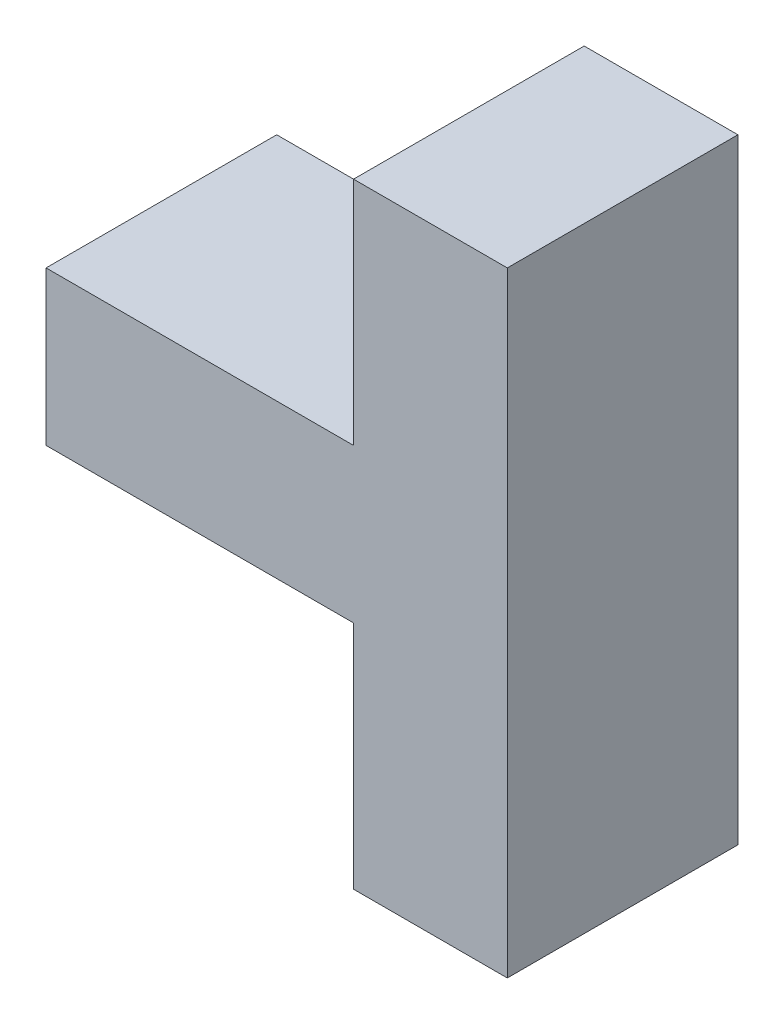
ISO-10303-21;
HEADER;
FILE_DESCRIPTION(('STEP AP214'),'2;1');
FILE_NAME('part.step','',(''),(''),'','','');
FILE_SCHEMA(('AUTOMOTIVE_DESIGN { 1 0 10303 214 1 1 1 1 }'));
ENDSEC;
DATA;
#1=APPLICATION_CONTEXT('core data for automotive mechanical design processes');
#2=APPLICATION_PROTOCOL_DEFINITION('international standard','automotive_design',2000,#1);
#3=PRODUCT_CONTEXT('',#1,'mechanical');
#4=PRODUCT('Part','Part','',(#3));
#5=PRODUCT_RELATED_PRODUCT_CATEGORY('part','',(#4));
#6=PRODUCT_DEFINITION_FORMATION('','',#4);
#7=PRODUCT_DEFINITION_CONTEXT('part definition',#1,'design');
#8=PRODUCT_DEFINITION('design','',#6,#7);
#9=PRODUCT_DEFINITION_SHAPE('','',#8);
#10=(LENGTH_UNIT() NAMED_UNIT(*) SI_UNIT(.MILLI.,.METRE.));
#11=(NAMED_UNIT(*) PLANE_ANGLE_UNIT() SI_UNIT($,.RADIAN.));
#12=(NAMED_UNIT(*) SI_UNIT($,.STERADIAN.) SOLID_ANGLE_UNIT());
#13=UNCERTAINTY_MEASURE_WITH_UNIT(LENGTH_MEASURE(1.E-05),#10,'distance_accuracy_value','');
#14=(GEOMETRIC_REPRESENTATION_CONTEXT(3) GLOBAL_UNCERTAINTY_ASSIGNED_CONTEXT((#13)) GLOBAL_UNIT_ASSIGNED_CONTEXT((#10,
#11,#12)) REPRESENTATION_CONTEXT('',''));
#15=CARTESIAN_POINT('',(0.,0.,0.));
#16=DIRECTION('',(0.,0.,1.));
#17=DIRECTION('',(1.,0.,0.));
#18=AXIS2_PLACEMENT_3D('',#15,#16,#17);
#19=CARTESIAN_POINT('',(0.09999980000001,-0.09999980000001,0.));
#20=DIRECTION('',(1.,0.,0.));
#21=DIRECTION('',(0.,0.,-1.));
#22=AXIS2_PLACEMENT_3D('',#19,#20,#21);
#23=PLANE('',#22);
#24=DIRECTION('',(0.,0.,1.));
#25=VECTOR('',#24,1.);
#26=CARTESIAN_POINT('',(0.09999980000001,-0.3999992,0.));
#27=LINE('',#26,#25);
#28=CARTESIAN_POINT('',(0.09999980000001,-0.3999992,0.));
#29=VERTEX_POINT('',#28);
#30=CARTESIAN_POINT('',(0.09999980000001,-0.3999992,0.2999994));
#31=VERTEX_POINT('',#30);
#32=EDGE_CURVE('E84',#29,#31,#27,.T.);
#33=ORIENTED_EDGE('',*,*,#32,.T.);
#34=DIRECTION('',(0.,1.,0.));
#35=VECTOR('',#34,1.);
#36=CARTESIAN_POINT('',(0.09999980000001,-0.3999992,0.2999994));
#37=LINE('',#36,#35);
#38=CARTESIAN_POINT('',(0.09999980000001,-0.09999980000001,0.2999994));
#39=VERTEX_POINT('',#38);
#40=EDGE_CURVE('E86',#31,#39,#37,.T.);
#41=ORIENTED_EDGE('',*,*,#40,.T.);
#42=DIRECTION('',(0.,0.,1.));
#43=VECTOR('',#42,1.);
#44=CARTESIAN_POINT('',(0.09999980000001,-0.09999980000001,0.));
#45=LINE('',#44,#43);
#46=CARTESIAN_POINT('',(0.09999980000001,-0.09999980000001,0.));
#47=VERTEX_POINT('',#46);
#48=EDGE_CURVE('E20',#39,#47,#45,.F.);
#49=ORIENTED_EDGE('',*,*,#48,.T.);
#50=DIRECTION('',(0.,1.,0.));
#51=VECTOR('',#50,1.);
#52=CARTESIAN_POINT('',(0.09999980000001,-0.3999992,0.));
#53=LINE('',#52,#51);
#54=EDGE_CURVE('E87',#29,#47,#53,.T.);
#55=ORIENTED_EDGE('',*,*,#54,.F.);
#56=EDGE_LOOP('',(#33,#41,#49,#55));
#57=FACE_BOUND('',#56,.T.);
#58=ADVANCED_FACE('F17',(#57),#23,.F.);
#59=CARTESIAN_POINT('',(-0.2999994,-0.09999980000001,0.));
#60=DIRECTION('',(0.,1.,0.));
#61=DIRECTION('',(0.,0.,1.));
#62=AXIS2_PLACEMENT_3D('',#59,#60,#61);
#63=PLANE('',#62);
#64=ORIENTED_EDGE('',*,*,#48,.F.);
#65=DIRECTION('',(-1.,0.,0.));
#66=VECTOR('',#65,1.);
#67=CARTESIAN_POINT('',(0.2999994,-0.09999980000001,0.2999994));
#68=LINE('',#67,#66);
#69=CARTESIAN_POINT('',(-0.2999994,-0.09999980000001,0.2999994));
#70=VERTEX_POINT('',#69);
#71=EDGE_CURVE('E101',#39,#70,#68,.T.);
#72=ORIENTED_EDGE('',*,*,#71,.T.);
#73=DIRECTION('',(0.,0.,-1.));
#74=VECTOR('',#73,1.);
#75=CARTESIAN_POINT('',(-0.2999994,-0.09999980000001,0.));
#76=LINE('',#75,#74);
#77=CARTESIAN_POINT('',(-0.2999994,-0.09999980000001,0.));
#78=VERTEX_POINT('',#77);
#79=EDGE_CURVE('E113',#70,#78,#76,.T.);
#80=ORIENTED_EDGE('',*,*,#79,.T.);
#81=DIRECTION('',(-1.,0.,0.));
#82=VECTOR('',#81,1.);
#83=CARTESIAN_POINT('',(0.2999994,-0.09999980000001,0.));
#84=LINE('',#83,#82);
#85=EDGE_CURVE('E116',#47,#78,#84,.T.);
#86=ORIENTED_EDGE('',*,*,#85,.F.);
#87=EDGE_LOOP('',(#64,#72,#80,#86));
#88=FACE_BOUND('',#87,.T.);
#89=ADVANCED_FACE('F117',(#88),#63,.F.);
#90=CARTESIAN_POINT('',(-0.2999994,0.09999979999999,0.));
#91=DIRECTION('',(1.,0.,0.));
#92=DIRECTION('',(0.,0.,-1.));
#93=AXIS2_PLACEMENT_3D('',#90,#91,#92);
#94=PLANE('',#93);
#95=ORIENTED_EDGE('',*,*,#79,.F.);
#96=DIRECTION('',(0.,1.,0.));
#97=VECTOR('',#96,1.);
#98=CARTESIAN_POINT('',(-0.2999994,-0.3999992,0.2999994));
#99=LINE('',#98,#97);
#100=CARTESIAN_POINT('',(-0.2999994,0.09999979999999,0.2999994));
#101=VERTEX_POINT('',#100);
#102=EDGE_CURVE('E137',#70,#101,#99,.T.);
#103=ORIENTED_EDGE('',*,*,#102,.T.);
#104=DIRECTION('',(0.,0.,-1.));
#105=VECTOR('',#104,1.);
#106=CARTESIAN_POINT('',(-0.2999994,0.09999979999999,0.));
#107=LINE('',#106,#105);
#108=CARTESIAN_POINT('',(-0.2999994,0.09999979999999,0.));
#109=VERTEX_POINT('',#108);
#110=EDGE_CURVE('E111',#101,#109,#107,.T.);
#111=ORIENTED_EDGE('',*,*,#110,.T.);
#112=DIRECTION('',(0.,1.,0.));
#113=VECTOR('',#112,1.);
#114=CARTESIAN_POINT('',(-0.2999994,-0.3999992,0.));
#115=LINE('',#114,#113);
#116=EDGE_CURVE('E118',#78,#109,#115,.T.);
#117=ORIENTED_EDGE('',*,*,#116,.F.);
#118=EDGE_LOOP('',(#95,#103,#111,#117));
#119=FACE_BOUND('',#118,.T.);
#120=ADVANCED_FACE('F140',(#119),#94,.F.);
#121=CARTESIAN_POINT('',(0.09999980000001,0.09999979999999,0.));
#122=DIRECTION('',(0.,-1.,0.));
#123=DIRECTION('',(0.,0.,-1.));
#124=AXIS2_PLACEMENT_3D('',#121,#122,#123);
#125=PLANE('',#124);
#126=ORIENTED_EDGE('',*,*,#110,.F.);
#127=DIRECTION('',(-1.,0.,0.));
#128=VECTOR('',#127,1.);
#129=CARTESIAN_POINT('',(0.2999994,0.09999979999999,0.2999994));
#130=LINE('',#129,#128);
#131=CARTESIAN_POINT('',(0.09999980000001,0.09999979999999,0.2999994));
#132=VERTEX_POINT('',#131);
#133=EDGE_CURVE('E134',#101,#132,#130,.F.);
#134=ORIENTED_EDGE('',*,*,#133,.T.);
#135=DIRECTION('',(0.,0.,-1.));
#136=VECTOR('',#135,1.);
#137=CARTESIAN_POINT('',(0.09999980000001,0.09999979999999,0.));
#138=LINE('',#137,#136);
#139=CARTESIAN_POINT('',(0.09999980000001,0.09999979999999,0.));
#140=VERTEX_POINT('',#139);
#141=EDGE_CURVE('E93',#132,#140,#138,.T.);
#142=ORIENTED_EDGE('',*,*,#141,.T.);
#143=DIRECTION('',(-1.,0.,0.));
#144=VECTOR('',#143,1.);
#145=CARTESIAN_POINT('',(0.2999994,0.09999979999999,0.));
#146=LINE('',#145,#144);
#147=EDGE_CURVE('E120',#109,#140,#146,.F.);
#148=ORIENTED_EDGE('',*,*,#147,.F.);
#149=EDGE_LOOP('',(#126,#134,#142,#148));
#150=FACE_BOUND('',#149,.T.);
#151=ADVANCED_FACE('F145',(#150),#125,.F.);
#152=CARTESIAN_POINT('',(0.09999980000001,0.3999992,0.));
#153=DIRECTION('',(1.,0.,0.));
#154=DIRECTION('',(0.,0.,-1.));
#155=AXIS2_PLACEMENT_3D('',#152,#153,#154);
#156=PLANE('',#155);
#157=ORIENTED_EDGE('',*,*,#141,.F.);
#158=DIRECTION('',(0.,1.,0.));
#159=VECTOR('',#158,1.);
#160=CARTESIAN_POINT('',(0.09999980000001,-0.3999992,0.2999994));
#161=LINE('',#160,#159);
#162=CARTESIAN_POINT('',(0.09999980000001,0.3999992,0.2999994));
#163=VERTEX_POINT('',#162);
#164=EDGE_CURVE('E132',#132,#163,#161,.T.);
#165=ORIENTED_EDGE('',*,*,#164,.T.);
#166=DIRECTION('',(0.,0.,-1.));
#167=VECTOR('',#166,1.);
#168=CARTESIAN_POINT('',(0.09999980000001,0.3999992,0.));
#169=LINE('',#168,#167);
#170=CARTESIAN_POINT('',(0.09999980000001,0.3999992,0.));
#171=VERTEX_POINT('',#170);
#172=EDGE_CURVE('E127',#163,#171,#169,.T.);
#173=ORIENTED_EDGE('',*,*,#172,.T.);
#174=DIRECTION('',(0.,1.,0.));
#175=VECTOR('',#174,1.);
#176=CARTESIAN_POINT('',(0.09999980000001,-0.3999992,0.));
#177=LINE('',#176,#175);
#178=EDGE_CURVE('E147',#140,#171,#177,.T.);
#179=ORIENTED_EDGE('',*,*,#178,.F.);
#180=EDGE_LOOP('',(#157,#165,#173,#179));
#181=FACE_BOUND('',#180,.T.);
#182=ADVANCED_FACE('F176',(#181),#156,.F.);
#183=CARTESIAN_POINT('',(0.09999980000001,-0.3999992,0.));
#184=DIRECTION('',(0.,1.,0.));
#185=DIRECTION('',(0.,0.,1.));
#186=AXIS2_PLACEMENT_3D('',#183,#184,#185);
#187=PLANE('',#186);
#188=DIRECTION('',(0.,0.,1.));
#189=VECTOR('',#188,1.);
#190=CARTESIAN_POINT('',(0.2999994,-0.3999992,0.));
#191=LINE('',#190,#189);
#192=CARTESIAN_POINT('',(0.2999994,-0.3999992,0.));
#193=VERTEX_POINT('',#192);
#194=CARTESIAN_POINT('',(0.2999994,-0.3999992,0.2999994));
#195=VERTEX_POINT('',#194);
#196=EDGE_CURVE('E105',#193,#195,#191,.T.);
#197=ORIENTED_EDGE('',*,*,#196,.T.);
#198=DIRECTION('',(-1.,0.,0.));
#199=VECTOR('',#198,1.);
#200=CARTESIAN_POINT('',(0.2999994,-0.3999992,0.2999994));
#201=LINE('',#200,#199);
#202=EDGE_CURVE('E92',#195,#31,#201,.T.);
#203=ORIENTED_EDGE('',*,*,#202,.T.);
#204=ORIENTED_EDGE('',*,*,#32,.F.);
#205=DIRECTION('',(-1.,0.,0.));
#206=VECTOR('',#205,1.);
#207=CARTESIAN_POINT('',(0.2999994,-0.3999992,0.));
#208=LINE('',#207,#206);
#209=EDGE_CURVE('E122',#193,#29,#208,.T.);
#210=ORIENTED_EDGE('',*,*,#209,.F.);
#211=EDGE_LOOP('',(#197,#203,#204,#210));
#212=FACE_BOUND('',#211,.T.);
#213=ADVANCED_FACE('F104',(#212),#187,.F.);
#214=CARTESIAN_POINT('',(0.2999994,-0.3999992,0.2999994));
#215=DIRECTION('',(0.,0.,-1.));
#216=DIRECTION('',(-1.,0.,0.));
#217=AXIS2_PLACEMENT_3D('',#214,#215,#216);
#218=PLANE('',#217);
#219=DIRECTION('',(1.,0.,0.));
#220=VECTOR('',#219,1.);
#221=CARTESIAN_POINT('',(0.2999994,0.3999992,0.2999994));
#222=LINE('',#221,#220);
#223=CARTESIAN_POINT('',(0.2999994,0.3999992,0.2999994));
#224=VERTEX_POINT('',#223);
#225=EDGE_CURVE('E130',#224,#163,#222,.F.);
#226=ORIENTED_EDGE('',*,*,#225,.T.);
#227=ORIENTED_EDGE('',*,*,#164,.F.);
#228=ORIENTED_EDGE('',*,*,#133,.F.);
#229=ORIENTED_EDGE('',*,*,#102,.F.);
#230=ORIENTED_EDGE('',*,*,#71,.F.);
#231=ORIENTED_EDGE('',*,*,#40,.F.);
#232=ORIENTED_EDGE('',*,*,#202,.F.);
#233=DIRECTION('',(0.,1.,0.));
#234=VECTOR('',#233,1.);
#235=CARTESIAN_POINT('',(0.2999994,-0.3999992,0.2999994));
#236=LINE('',#235,#234);
#237=EDGE_CURVE('E152',#195,#224,#236,.T.);
#238=ORIENTED_EDGE('',*,*,#237,.T.);
#239=EDGE_LOOP('',(#226,#227,#228,#229,#230,#231,#232,#238));
#240=FACE_BOUND('',#239,.T.);
#241=ADVANCED_FACE('F97',(#240),#218,.F.);
#242=CARTESIAN_POINT('',(0.2999994,0.3999992,0.));
#243=DIRECTION('',(0.,-1.,0.));
#244=DIRECTION('',(0.,0.,-1.));
#245=AXIS2_PLACEMENT_3D('',#242,#243,#244);
#246=PLANE('',#245);
#247=ORIENTED_EDGE('',*,*,#172,.F.);
#248=ORIENTED_EDGE('',*,*,#225,.F.);
#249=DIRECTION('',(0.,0.,1.));
#250=VECTOR('',#249,1.);
#251=CARTESIAN_POINT('',(0.2999994,0.3999992,0.));
#252=LINE('',#251,#250);
#253=CARTESIAN_POINT('',(0.2999994,0.3999992,0.));
#254=VERTEX_POINT('',#253);
#255=EDGE_CURVE('E26',#224,#254,#252,.F.);
#256=ORIENTED_EDGE('',*,*,#255,.T.);
#257=DIRECTION('',(-1.,0.,0.));
#258=VECTOR('',#257,1.);
#259=CARTESIAN_POINT('',(0.2999994,0.3999992,0.));
#260=LINE('',#259,#258);
#261=EDGE_CURVE('E34',#171,#254,#260,.F.);
#262=ORIENTED_EDGE('',*,*,#261,.F.);
#263=EDGE_LOOP('',(#247,#248,#256,#262));
#264=FACE_BOUND('',#263,.T.);
#265=ADVANCED_FACE('F158',(#264),#246,.F.);
#266=CARTESIAN_POINT('',(0.2999994,-0.3999992,0.));
#267=DIRECTION('',(0.,0.,-1.));
#268=DIRECTION('',(-1.,0.,0.));
#269=AXIS2_PLACEMENT_3D('',#266,#267,#268);
#270=PLANE('',#269);
#271=ORIENTED_EDGE('',*,*,#261,.T.);
#272=DIRECTION('',(0.,1.,0.));
#273=VECTOR('',#272,1.);
#274=CARTESIAN_POINT('',(0.2999994,-0.3999992,0.));
#275=LINE('',#274,#273);
#276=EDGE_CURVE('E11',#254,#193,#275,.F.);
#277=ORIENTED_EDGE('',*,*,#276,.T.);
#278=ORIENTED_EDGE('',*,*,#209,.T.);
#279=ORIENTED_EDGE('',*,*,#54,.T.);
#280=ORIENTED_EDGE('',*,*,#85,.T.);
#281=ORIENTED_EDGE('',*,*,#116,.T.);
#282=ORIENTED_EDGE('',*,*,#147,.T.);
#283=ORIENTED_EDGE('',*,*,#178,.T.);
#284=EDGE_LOOP('',(#271,#277,#278,#279,#280,#281,#282,#283));
#285=FACE_BOUND('',#284,.T.);
#286=ADVANCED_FACE('F161',(#285),#270,.T.);
#287=CARTESIAN_POINT('',(0.2999994,-0.3999992,0.));
#288=DIRECTION('',(-1.,0.,0.));
#289=DIRECTION('',(0.,0.,1.));
#290=AXIS2_PLACEMENT_3D('',#287,#288,#289);
#291=PLANE('',#290);
#292=ORIENTED_EDGE('',*,*,#255,.F.);
#293=ORIENTED_EDGE('',*,*,#237,.F.);
#294=ORIENTED_EDGE('',*,*,#196,.F.);
#295=ORIENTED_EDGE('',*,*,#276,.F.);
#296=EDGE_LOOP('',(#292,#293,#294,#295));
#297=FACE_BOUND('',#296,.T.);
#298=ADVANCED_FACE('F160',(#297),#291,.F.);
#299=CLOSED_SHELL('',(#58,#89,#120,#151,#182,#213,#241,#265,#286,#298));
#300=MANIFOLD_SOLID_BREP('B1',#299);
#301=ADVANCED_BREP_SHAPE_REPRESENTATION('',(#18,#300),#14);
#302=SHAPE_DEFINITION_REPRESENTATION(#9,#301);
ENDSEC;
END-ISO-10303-21;
